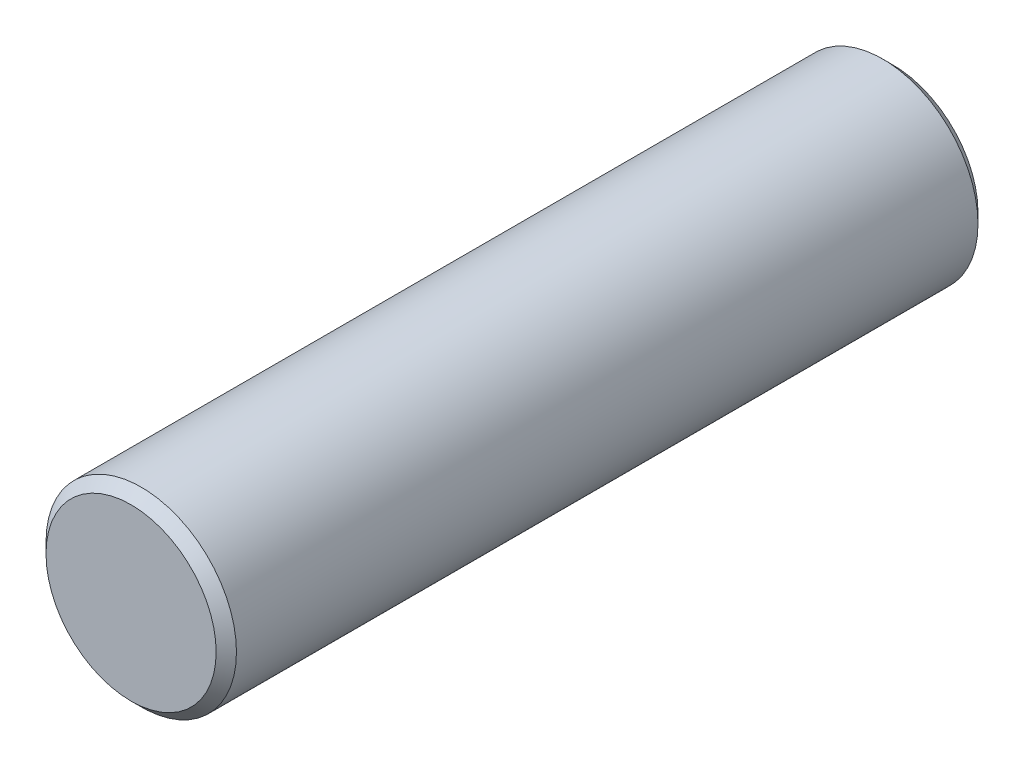
ISO-10303-21;
HEADER;
FILE_DESCRIPTION(('STEP AP214'),'2;1');
FILE_NAME('part.step','',(''),(''),'','','');
FILE_SCHEMA(('AUTOMOTIVE_DESIGN { 1 0 10303 214 1 1 1 1 }'));
ENDSEC;
DATA;
#1=APPLICATION_CONTEXT('core data for automotive mechanical design processes');
#2=APPLICATION_PROTOCOL_DEFINITION('international standard','automotive_design',2000,#1);
#3=PRODUCT_CONTEXT('',#1,'mechanical');
#4=PRODUCT('Part','Part','',(#3));
#5=PRODUCT_RELATED_PRODUCT_CATEGORY('part','',(#4));
#6=PRODUCT_DEFINITION_FORMATION('','',#4);
#7=PRODUCT_DEFINITION_CONTEXT('part definition',#1,'design');
#8=PRODUCT_DEFINITION('design','',#6,#7);
#9=PRODUCT_DEFINITION_SHAPE('','',#8);
#10=(LENGTH_UNIT() NAMED_UNIT(*) SI_UNIT(.MILLI.,.METRE.));
#11=(NAMED_UNIT(*) PLANE_ANGLE_UNIT() SI_UNIT($,.RADIAN.));
#12=(NAMED_UNIT(*) SI_UNIT($,.STERADIAN.) SOLID_ANGLE_UNIT());
#13=UNCERTAINTY_MEASURE_WITH_UNIT(LENGTH_MEASURE(1.E-05),#10,'distance_accuracy_value','');
#14=(GEOMETRIC_REPRESENTATION_CONTEXT(3) GLOBAL_UNCERTAINTY_ASSIGNED_CONTEXT((#13)) GLOBAL_UNIT_ASSIGNED_CONTEXT((#10,
#11,#12)) REPRESENTATION_CONTEXT('',''));
#15=CARTESIAN_POINT('',(0.,0.,0.));
#16=DIRECTION('',(0.,0.,1.));
#17=DIRECTION('',(1.,0.,0.));
#18=AXIS2_PLACEMENT_3D('',#15,#16,#17);
#19=CARTESIAN_POINT('',(0.,0.,38.1));
#20=DIRECTION('',(0.,0.,-1.));
#21=DIRECTION('',(-1.,0.,0.));
#22=AXIS2_PLACEMENT_3D('',#19,#20,#21);
#23=CYLINDRICAL_SURFACE('',#22,4.7625);
#24=CARTESIAN_POINT('',(0.,0.,0.508000000000022));
#25=DIRECTION('',(0.,0.,1.));
#26=DIRECTION('',(1.,0.,0.));
#27=AXIS2_PLACEMENT_3D('',#24,#25,#26);
#28=CIRCLE('',#27,4.7625);
#29=CARTESIAN_POINT('',(-4.7625,0.,0.508000000000022));
#30=VERTEX_POINT('',#29);
#31=EDGE_CURVE('E45',#30,#30,#28,.T.);
#32=CARTESIAN_POINT('',(0.,0.,37.592));
#33=DIRECTION('',(0.,0.,1.));
#34=DIRECTION('',(1.,0.,0.));
#35=AXIS2_PLACEMENT_3D('',#32,#33,#34);
#36=CIRCLE('',#35,4.7625);
#37=CARTESIAN_POINT('',(-4.7625,0.,37.592));
#38=VERTEX_POINT('',#37);
#39=EDGE_CURVE('E49',#38,#38,#36,.F.);
#40=CARTESIAN_POINT('',(-4.7625,0.,0.508000000000022));
#41=CARTESIAN_POINT('',(-4.7625,0.,0.89429166666669));
#42=CARTESIAN_POINT('',(-4.7625,0.,1.28058333333336));
#43=CARTESIAN_POINT('',(-4.7625,0.,2.05316666666669));
#44=CARTESIAN_POINT('',(-4.7625,0.,2.43945833333336));
#45=CARTESIAN_POINT('',(-4.7625,0.,3.21204166666669));
#46=CARTESIAN_POINT('',(-4.7625,0.,3.59833333333335));
#47=CARTESIAN_POINT('',(-4.7625,0.,4.37091666666669));
#48=CARTESIAN_POINT('',(-4.7625,0.,4.75720833333336));
#49=CARTESIAN_POINT('',(-4.7625,0.,5.52979166666669));
#50=CARTESIAN_POINT('',(-4.7625,0.,5.91608333333336));
#51=CARTESIAN_POINT('',(-4.7625,0.,6.68866666666669));
#52=CARTESIAN_POINT('',(-4.7625,0.,7.07495833333336));
#53=CARTESIAN_POINT('',(-4.7625,0.,7.84754166666669));
#54=CARTESIAN_POINT('',(-4.7625,0.,8.23383333333335));
#55=CARTESIAN_POINT('',(-4.7625,0.,9.00641666666669));
#56=CARTESIAN_POINT('',(-4.7625,0.,9.39270833333335));
#57=CARTESIAN_POINT('',(-4.7625,0.,10.1652916666667));
#58=CARTESIAN_POINT('',(-4.7625,0.,10.5515833333334));
#59=CARTESIAN_POINT('',(-4.7625,0.,11.3241666666667));
#60=CARTESIAN_POINT('',(-4.7625,0.,11.7104583333334));
#61=CARTESIAN_POINT('',(-4.7625,0.,12.4830416666667));
#62=CARTESIAN_POINT('',(-4.7625,0.,12.8693333333334));
#63=CARTESIAN_POINT('',(-4.7625,0.,13.6419166666667));
#64=CARTESIAN_POINT('',(-4.7625,0.,14.0282083333334));
#65=CARTESIAN_POINT('',(-4.7625,0.,14.8007916666667));
#66=CARTESIAN_POINT('',(-4.7625,0.,15.1870833333334));
#67=CARTESIAN_POINT('',(-4.7625,0.,15.9596666666667));
#68=CARTESIAN_POINT('',(-4.7625,0.,16.3459583333334));
#69=CARTESIAN_POINT('',(-4.7625,0.,17.1185416666667));
#70=CARTESIAN_POINT('',(-4.7625,0.,17.5048333333334));
#71=CARTESIAN_POINT('',(-4.7625,0.,18.2774166666667));
#72=CARTESIAN_POINT('',(-4.7625,0.,18.6637083333334));
#73=CARTESIAN_POINT('',(-4.7625,0.,19.4362916666667));
#74=CARTESIAN_POINT('',(-4.7625,0.,19.8225833333334));
#75=CARTESIAN_POINT('',(-4.7625,0.,20.5951666666667));
#76=CARTESIAN_POINT('',(-4.7625,0.,20.9814583333334));
#77=CARTESIAN_POINT('',(-4.7625,0.,21.7540416666667));
#78=CARTESIAN_POINT('',(-4.7625,0.,22.1403333333334));
#79=CARTESIAN_POINT('',(-4.7625,0.,22.9129166666667));
#80=CARTESIAN_POINT('',(-4.7625,0.,23.2992083333334));
#81=CARTESIAN_POINT('',(-4.7625,0.,24.0717916666667));
#82=CARTESIAN_POINT('',(-4.7625,0.,24.4580833333334));
#83=CARTESIAN_POINT('',(-4.7625,0.,25.2306666666667));
#84=CARTESIAN_POINT('',(-4.7625,0.,25.6169583333334));
#85=CARTESIAN_POINT('',(-4.7625,0.,26.3895416666667));
#86=CARTESIAN_POINT('',(-4.7625,0.,26.7758333333334));
#87=CARTESIAN_POINT('',(-4.7625,0.,27.5484166666667));
#88=CARTESIAN_POINT('',(-4.7625,0.,27.9347083333334));
#89=CARTESIAN_POINT('',(-4.7625,0.,28.7072916666667));
#90=CARTESIAN_POINT('',(-4.7625,0.,29.0935833333334));
#91=CARTESIAN_POINT('',(-4.7625,0.,29.8661666666667));
#92=CARTESIAN_POINT('',(-4.7625,0.,30.2524583333334));
#93=CARTESIAN_POINT('',(-4.7625,0.,31.0250416666667));
#94=CARTESIAN_POINT('',(-4.7625,0.,31.4113333333334));
#95=CARTESIAN_POINT('',(-4.7625,0.,32.1839166666667));
#96=CARTESIAN_POINT('',(-4.7625,0.,32.5702083333333));
#97=CARTESIAN_POINT('',(-4.7625,0.,33.3427916666667));
#98=CARTESIAN_POINT('',(-4.7625,0.,33.7290833333334));
#99=CARTESIAN_POINT('',(-4.7625,0.,34.5016666666667));
#100=CARTESIAN_POINT('',(-4.7625,0.,34.8879583333334));
#101=CARTESIAN_POINT('',(-4.7625,0.,35.6605416666667));
#102=CARTESIAN_POINT('',(-4.7625,0.,36.0468333333334));
#103=CARTESIAN_POINT('',(-4.7625,0.,36.8194166666667));
#104=CARTESIAN_POINT('',(-4.7625,0.,37.2057083333333));
#105=CARTESIAN_POINT('',(-4.7625,0.,37.592));
#106=B_SPLINE_CURVE_WITH_KNOTS('',3,(#40,#41,#42,#43,#44,#45,#46,#47,#48,#49,#50,#51,#52,#53,
#54,#55,#56,#57,#58,#59,#60,#61,#62,#63,#64,#65,#66,#67,#68,#69,#70,#71,#72,#73,#74,#75,#76,#77,
#78,#79,#80,#81,#82,#83,#84,#85,#86,#87,#88,#89,#90,#91,#92,#93,#94,#95,#96,#97,#98,#99,#100,
#101,#102,#103,#104,#105),.UNSPECIFIED.,.F.,.F.,(4,2,2,2,2,2,2,2,2,2,2,2,2,2,2,2,2,2,2,2,2,2,2,
2,2,2,2,2,2,2,2,2,4),(0.,1.158875,2.31775,3.476625,4.6355,5.794375,6.95325,8.112125,9.271,
10.429875,11.58875,12.747625,13.9065,15.065375,16.22425,17.383125,18.542,19.700875,20.85975,
22.018625,23.1775,24.336375,25.49525,26.654125,27.813,28.971875,30.13075,31.289625,32.4485,
33.607375,34.76625,35.925125,37.084),.UNSPECIFIED.);
#107=EDGE_CURVE('BSEAM33',#30,#38,#106,.T.);
#108=ORIENTED_EDGE('',*,*,#31,.T.);
#109=ORIENTED_EDGE('',*,*,#39,.T.);
#110=ORIENTED_EDGE('',*,*,#107,.T.);
#111=ORIENTED_EDGE('',*,*,#107,.F.);
#112=EDGE_LOOP('',(#108,#110,#109,#111));
#113=FACE_BOUND('',#112,.T.);
#114=ADVANCED_FACE('F33',(#113),#23,.T.);
#115=CARTESIAN_POINT('',(0.,0.,38.1));
#116=DIRECTION('',(0.,0.,1.));
#117=DIRECTION('',(1.,0.,0.));
#118=AXIS2_PLACEMENT_3D('',#115,#116,#117);
#119=PLANE('',#118);
#120=CARTESIAN_POINT('',(0.,0.,38.1));
#121=DIRECTION('',(0.,0.,1.));
#122=DIRECTION('',(1.,0.,0.));
#123=AXIS2_PLACEMENT_3D('',#120,#121,#122);
#124=CIRCLE('',#123,4.25450000000002);
#125=CARTESIAN_POINT('',(4.25450000000002,0.,38.1));
#126=VERTEX_POINT('',#125);
#127=EDGE_CURVE('E10',#126,#126,#124,.T.);
#128=ORIENTED_EDGE('',*,*,#127,.T.);
#129=EDGE_LOOP('',(#128));
#130=FACE_BOUND('',#129,.T.);
#131=ADVANCED_FACE('F65',(#130),#119,.T.);
#132=CARTESIAN_POINT('',(0.,0.,0.));
#133=DIRECTION('',(0.,0.,1.));
#134=DIRECTION('',(1.,0.,0.));
#135=AXIS2_PLACEMENT_3D('',#132,#133,#134);
#136=PLANE('',#135);
#137=CARTESIAN_POINT('',(0.,0.,0.));
#138=DIRECTION('',(0.,0.,1.));
#139=DIRECTION('',(1.,0.,0.));
#140=AXIS2_PLACEMENT_3D('',#137,#138,#139);
#141=CIRCLE('',#140,4.25449999999997);
#142=CARTESIAN_POINT('',(4.25449999999997,0.,0.));
#143=VERTEX_POINT('',#142);
#144=EDGE_CURVE('E41',#143,#143,#141,.F.);
#145=ORIENTED_EDGE('',*,*,#144,.T.);
#146=EDGE_LOOP('',(#145));
#147=FACE_BOUND('',#146,.T.);
#148=ADVANCED_FACE('F62',(#147),#136,.F.);
#149=CARTESIAN_POINT('',(0.,0.,0.508000000000022));
#150=DIRECTION('',(0.,0.,1.));
#151=DIRECTION('',(1.,0.,0.));
#152=AXIS2_PLACEMENT_3D('',#149,#150,#151);
#153=CONICAL_SURFACE('',#152,4.7625,0.785398163397453);
#154=ORIENTED_EDGE('',*,*,#144,.F.);
#155=EDGE_LOOP('',(#154));
#156=FACE_BOUND('',#155,.T.);
#157=ORIENTED_EDGE('',*,*,#31,.F.);
#158=EDGE_LOOP('',(#157));
#159=FACE_BOUND('',#158,.T.);
#160=ADVANCED_FACE('F58',(#156,#159),#153,.T.);
#161=CARTESIAN_POINT('',(0.,0.,38.1));
#162=DIRECTION('',(0.,0.,-1.));
#163=DIRECTION('',(-1.,0.,0.));
#164=AXIS2_PLACEMENT_3D('',#161,#162,#163);
#165=CONICAL_SURFACE('',#164,4.25450000000002,0.785398163397452);
#166=ORIENTED_EDGE('',*,*,#39,.F.);
#167=EDGE_LOOP('',(#166));
#168=FACE_BOUND('',#167,.T.);
#169=ORIENTED_EDGE('',*,*,#127,.F.);
#170=EDGE_LOOP('',(#169));
#171=FACE_BOUND('',#170,.T.);
#172=ADVANCED_FACE('F36',(#168,#171),#165,.T.);
#173=CLOSED_SHELL('',(#114,#131,#148,#160,#172));
#174=MANIFOLD_SOLID_BREP('B2',#173);
#175=ADVANCED_BREP_SHAPE_REPRESENTATION('',(#18,#174),#14);
#176=SHAPE_DEFINITION_REPRESENTATION(#9,#175);
ENDSEC;
END-ISO-10303-21;
